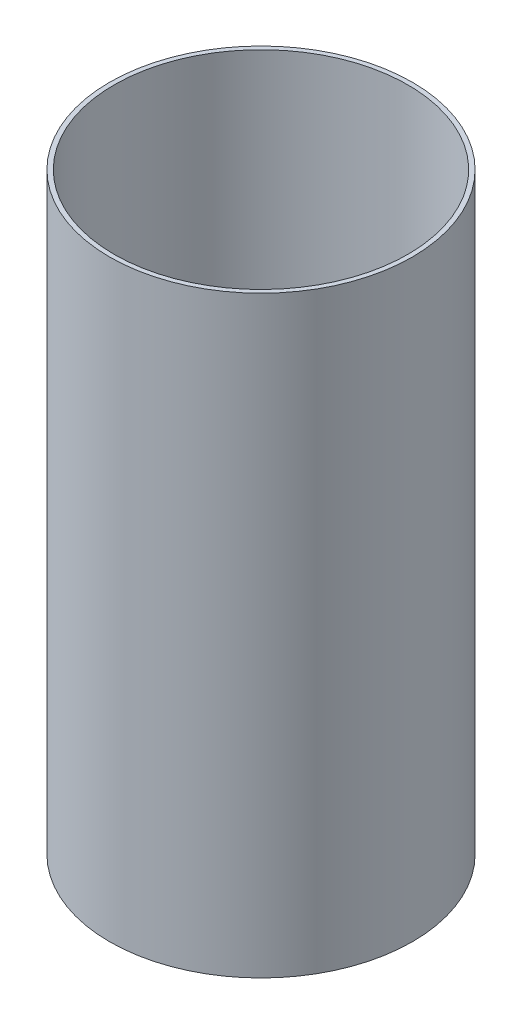
ISO-10303-21;
HEADER;
FILE_DESCRIPTION(('STEP AP214'),'2;1');
FILE_NAME('part.step','',(''),(''),'','','');
FILE_SCHEMA(('AUTOMOTIVE_DESIGN { 1 0 10303 214 1 1 1 1 }'));
ENDSEC;
DATA;
#1=APPLICATION_CONTEXT('core data for automotive mechanical design processes');
#2=APPLICATION_PROTOCOL_DEFINITION('international standard','automotive_design',2000,#1);
#3=PRODUCT_CONTEXT('',#1,'mechanical');
#4=PRODUCT('Part','Part','',(#3));
#5=PRODUCT_RELATED_PRODUCT_CATEGORY('part','',(#4));
#6=PRODUCT_DEFINITION_FORMATION('','',#4);
#7=PRODUCT_DEFINITION_CONTEXT('part definition',#1,'design');
#8=PRODUCT_DEFINITION('design','',#6,#7);
#9=PRODUCT_DEFINITION_SHAPE('','',#8);
#10=(LENGTH_UNIT() NAMED_UNIT(*) SI_UNIT(.MILLI.,.METRE.));
#11=(NAMED_UNIT(*) PLANE_ANGLE_UNIT() SI_UNIT($,.RADIAN.));
#12=(NAMED_UNIT(*) SI_UNIT($,.STERADIAN.) SOLID_ANGLE_UNIT());
#13=UNCERTAINTY_MEASURE_WITH_UNIT(LENGTH_MEASURE(1.E-05),#10,'distance_accuracy_value','');
#14=(GEOMETRIC_REPRESENTATION_CONTEXT(3) GLOBAL_UNCERTAINTY_ASSIGNED_CONTEXT((#13)) GLOBAL_UNIT_ASSIGNED_CONTEXT((#10,
#11,#12)) REPRESENTATION_CONTEXT('',''));
#15=CARTESIAN_POINT('',(0.,0.,0.));
#16=DIRECTION('',(0.,0.,1.));
#17=DIRECTION('',(1.,0.,0.));
#18=AXIS2_PLACEMENT_3D('',#15,#16,#17);
#19=CARTESIAN_POINT('',(0.,1988.,0.));
#20=DIRECTION('',(0.,1.,0.));
#21=DIRECTION('',(0.,0.,1.));
#22=AXIS2_PLACEMENT_3D('',#19,#20,#21);
#23=CYLINDRICAL_SURFACE('',#22,49.53);
#24=CARTESIAN_POINT('',(0.,1978.,0.));
#25=DIRECTION('',(0.,1.,0.));
#26=DIRECTION('',(0.,0.,1.));
#27=AXIS2_PLACEMENT_3D('',#24,#25,#26);
#28=CIRCLE('',#27,49.53);
#29=CARTESIAN_POINT('',(0.,1978.,49.53));
#30=VERTEX_POINT('',#29);
#31=EDGE_CURVE('E59',#30,#30,#28,.T.);
#32=ORIENTED_EDGE('',*,*,#31,.T.);
#33=EDGE_LOOP('',(#32));
#34=FACE_BOUND('',#33,.T.);
#35=CARTESIAN_POINT('',(0.,1778.,0.));
#36=DIRECTION('',(0.,1.,0.));
#37=DIRECTION('',(0.,0.,1.));
#38=AXIS2_PLACEMENT_3D('',#35,#36,#37);
#39=CIRCLE('',#38,49.53);
#40=CARTESIAN_POINT('',(0.,1778.,49.53));
#41=VERTEX_POINT('',#40);
#42=EDGE_CURVE('E10',#41,#41,#39,.T.);
#43=ORIENTED_EDGE('',*,*,#42,.F.);
#44=EDGE_LOOP('',(#43));
#45=FACE_BOUND('',#44,.T.);
#46=ADVANCED_FACE('F45',(#34,#45),#23,.F.);
#47=CARTESIAN_POINT('',(-51.054,1778.,0.));
#48=DIRECTION('',(0.,-1.,0.));
#49=DIRECTION('',(0.,0.,-1.));
#50=AXIS2_PLACEMENT_3D('',#47,#48,#49);
#51=PLANE('',#50);
#52=ORIENTED_EDGE('',*,*,#42,.T.);
#53=EDGE_LOOP('',(#52));
#54=FACE_BOUND('',#53,.T.);
#55=CARTESIAN_POINT('',(0.,1778.,0.));
#56=DIRECTION('',(0.,1.,0.));
#57=DIRECTION('',(0.,0.,1.));
#58=AXIS2_PLACEMENT_3D('',#55,#56,#57);
#59=CIRCLE('',#58,51.054);
#60=CARTESIAN_POINT('',(0.,1778.,51.054));
#61=VERTEX_POINT('',#60);
#62=EDGE_CURVE('E51',#61,#61,#59,.T.);
#63=ORIENTED_EDGE('',*,*,#62,.F.);
#64=EDGE_LOOP('',(#63));
#65=FACE_BOUND('',#64,.T.);
#66=ADVANCED_FACE('F75',(#54,#65),#51,.T.);
#67=CARTESIAN_POINT('',(0.,1988.,0.));
#68=DIRECTION('',(0.,1.,0.));
#69=DIRECTION('',(0.,0.,1.));
#70=AXIS2_PLACEMENT_3D('',#67,#68,#69);
#71=CYLINDRICAL_SURFACE('',#70,51.054);
#72=ORIENTED_EDGE('',*,*,#62,.T.);
#73=EDGE_LOOP('',(#72));
#74=FACE_BOUND('',#73,.T.);
#75=CARTESIAN_POINT('',(0.,1978.,0.));
#76=DIRECTION('',(0.,1.,0.));
#77=DIRECTION('',(0.,0.,1.));
#78=AXIS2_PLACEMENT_3D('',#75,#76,#77);
#79=CIRCLE('',#78,51.054);
#80=CARTESIAN_POINT('',(0.,1978.,51.054));
#81=VERTEX_POINT('',#80);
#82=EDGE_CURVE('E55',#81,#81,#79,.T.);
#83=ORIENTED_EDGE('',*,*,#82,.F.);
#84=EDGE_LOOP('',(#83));
#85=FACE_BOUND('',#84,.T.);
#86=ADVANCED_FACE('F69',(#74,#85),#71,.T.);
#87=CARTESIAN_POINT('',(-51.054,1978.,0.));
#88=DIRECTION('',(0.,1.,0.));
#89=DIRECTION('',(0.,0.,1.));
#90=AXIS2_PLACEMENT_3D('',#87,#88,#89);
#91=PLANE('',#90);
#92=ORIENTED_EDGE('',*,*,#82,.T.);
#93=EDGE_LOOP('',(#92));
#94=FACE_BOUND('',#93,.T.);
#95=ORIENTED_EDGE('',*,*,#31,.F.);
#96=EDGE_LOOP('',(#95));
#97=FACE_BOUND('',#96,.T.);
#98=ADVANCED_FACE('F67',(#94,#97),#91,.T.);
#99=CLOSED_SHELL('',(#46,#66,#86,#98));
#100=MANIFOLD_SOLID_BREP('B2',#99);
#101=ADVANCED_BREP_SHAPE_REPRESENTATION('',(#18,#100),#14);
#102=SHAPE_DEFINITION_REPRESENTATION(#9,#101);
ENDSEC;
END-ISO-10303-21;
